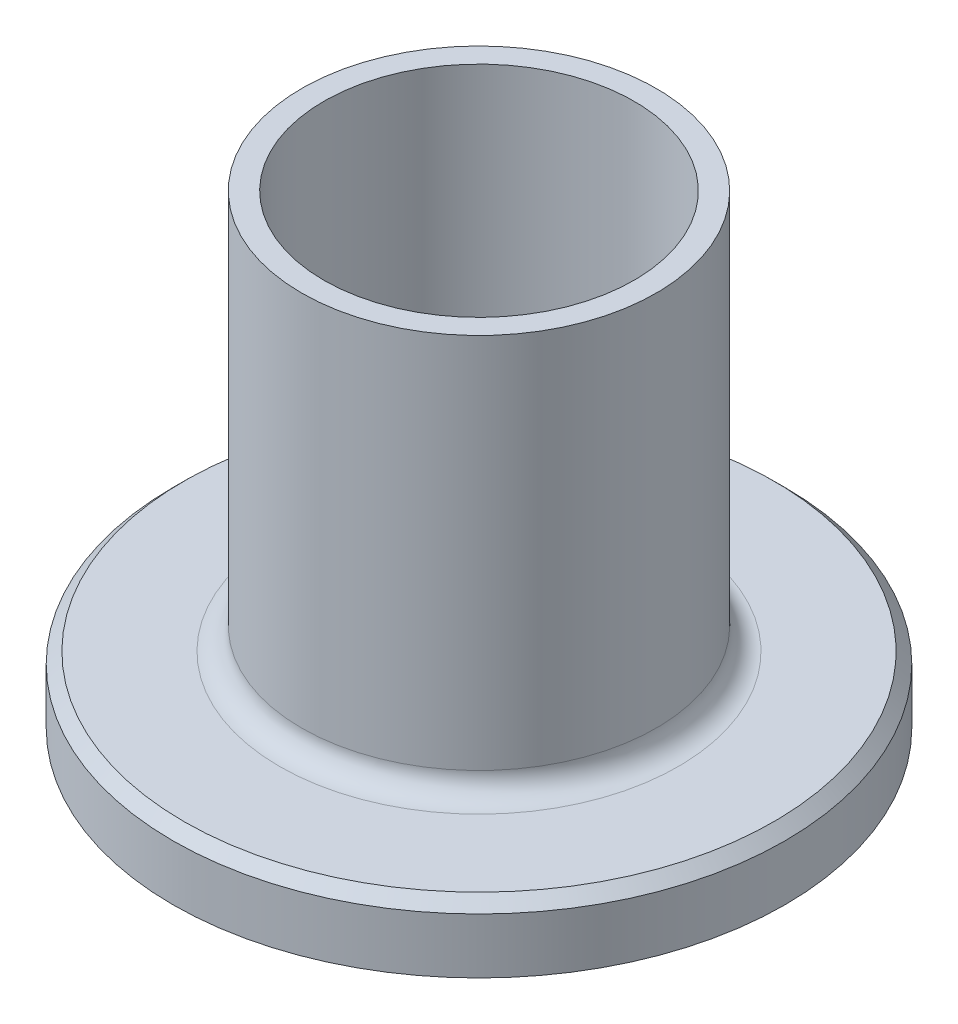
ISO-10303-21;
HEADER;
FILE_DESCRIPTION(('STEP AP214'),'2;1');
FILE_NAME('part.step','',(''),(''),'','','');
FILE_SCHEMA(('AUTOMOTIVE_DESIGN { 1 0 10303 214 1 1 1 1 }'));
ENDSEC;
DATA;
#1=APPLICATION_CONTEXT('core data for automotive mechanical design processes');
#2=APPLICATION_PROTOCOL_DEFINITION('international standard','automotive_design',2000,#1);
#3=PRODUCT_CONTEXT('',#1,'mechanical');
#4=PRODUCT('Part','Part','',(#3));
#5=PRODUCT_RELATED_PRODUCT_CATEGORY('part','',(#4));
#6=PRODUCT_DEFINITION_FORMATION('','',#4);
#7=PRODUCT_DEFINITION_CONTEXT('part definition',#1,'design');
#8=PRODUCT_DEFINITION('design','',#6,#7);
#9=PRODUCT_DEFINITION_SHAPE('','',#8);
#10=(LENGTH_UNIT() NAMED_UNIT(*) SI_UNIT(.MILLI.,.METRE.));
#11=(NAMED_UNIT(*) PLANE_ANGLE_UNIT() SI_UNIT($,.RADIAN.));
#12=(NAMED_UNIT(*) SI_UNIT($,.STERADIAN.) SOLID_ANGLE_UNIT());
#13=UNCERTAINTY_MEASURE_WITH_UNIT(LENGTH_MEASURE(1.E-05),#10,'distance_accuracy_value','');
#14=(GEOMETRIC_REPRESENTATION_CONTEXT(3) GLOBAL_UNCERTAINTY_ASSIGNED_CONTEXT((#13)) GLOBAL_UNIT_ASSIGNED_CONTEXT((#10,
#11,#12)) REPRESENTATION_CONTEXT('',''));
#15=CARTESIAN_POINT('',(0.,0.,0.));
#16=DIRECTION('',(0.,0.,1.));
#17=DIRECTION('',(1.,0.,0.));
#18=AXIS2_PLACEMENT_3D('',#15,#16,#17);
#19=CARTESIAN_POINT('',(0.,0.,0.));
#20=DIRECTION('',(0.,1.,0.));
#21=DIRECTION('',(0.,0.,1.));
#22=AXIS2_PLACEMENT_3D('',#19,#20,#21);
#23=PLANE('',#22);
#24=CARTESIAN_POINT('',(0.,0.,0.));
#25=DIRECTION('',(0.,1.,0.));
#26=DIRECTION('',(0.,0.,1.));
#27=AXIS2_PLACEMENT_3D('',#24,#25,#26);
#28=CIRCLE('',#27,21.1407400337106);
#29=CARTESIAN_POINT('',(0.,0.,21.1407400337106));
#30=VERTEX_POINT('',#29);
#31=EDGE_CURVE('E64',#30,#30,#28,.T.);
#32=ORIENTED_EDGE('',*,*,#31,.T.);
#33=EDGE_LOOP('',(#32));
#34=FACE_BOUND('',#33,.T.);
#35=CARTESIAN_POINT('',(0.,0.,0.));
#36=DIRECTION('',(0.,-1.,0.));
#37=DIRECTION('',(0.,0.,-1.));
#38=AXIS2_PLACEMENT_3D('',#35,#36,#37);
#39=CIRCLE('',#38,25.);
#40=CARTESIAN_POINT('',(0.,0.,-25.));
#41=VERTEX_POINT('',#40);
#42=EDGE_CURVE('E83',#41,#41,#39,.T.);
#43=ORIENTED_EDGE('',*,*,#42,.T.);
#44=EDGE_LOOP('',(#43));
#45=FACE_BOUND('',#44,.T.);
#46=ADVANCED_FACE('F38',(#34,#45),#23,.F.);
#47=CARTESIAN_POINT('',(0.,6.,0.));
#48=DIRECTION('',(0.,-1.,0.));
#49=DIRECTION('',(0.,0.,-1.));
#50=AXIS2_PLACEMENT_3D('',#47,#48,#49);
#51=CYLINDRICAL_SURFACE('',#50,27.62);
#52=CARTESIAN_POINT('',(0.,4.99999999999999,0.));
#53=DIRECTION('',(0.,1.,0.));
#54=DIRECTION('',(0.,0.,1.));
#55=AXIS2_PLACEMENT_3D('',#52,#53,#54);
#56=CIRCLE('',#55,27.62);
#57=CARTESIAN_POINT('',(0.,4.99999999999999,27.62));
#58=VERTEX_POINT('',#57);
#59=EDGE_CURVE('E58',#58,#58,#56,.F.);
#60=ORIENTED_EDGE('',*,*,#59,.T.);
#61=EDGE_LOOP('',(#60));
#62=FACE_BOUND('',#61,.T.);
#63=CARTESIAN_POINT('',(0.,0.,0.));
#64=DIRECTION('',(0.,1.,0.));
#65=DIRECTION('',(0.,0.,1.));
#66=AXIS2_PLACEMENT_3D('',#63,#64,#65);
#67=CIRCLE('',#66,27.62);
#68=CARTESIAN_POINT('',(0.,0.,27.62));
#69=VERTEX_POINT('',#68);
#70=EDGE_CURVE('E67',#69,#69,#67,.T.);
#71=ORIENTED_EDGE('',*,*,#70,.T.);
#72=EDGE_LOOP('',(#71));
#73=FACE_BOUND('',#72,.T.);
#74=ADVANCED_FACE('F113',(#62,#73),#51,.T.);
#75=CARTESIAN_POINT('',(0.,6.,0.));
#76=DIRECTION('',(0.,1.,0.));
#77=DIRECTION('',(0.,0.,1.));
#78=AXIS2_PLACEMENT_3D('',#75,#76,#77);
#79=PLANE('',#78);
#80=CARTESIAN_POINT('',(0.,6.,0.));
#81=DIRECTION('',(0.,1.,0.));
#82=DIRECTION('',(0.,0.,1.));
#83=AXIS2_PLACEMENT_3D('',#80,#81,#82);
#84=CIRCLE('',#83,18.);
#85=CARTESIAN_POINT('',(0.,6.,18.));
#86=VERTEX_POINT('',#85);
#87=EDGE_CURVE('E49',#86,#86,#84,.F.);
#88=ORIENTED_EDGE('',*,*,#87,.T.);
#89=EDGE_LOOP('',(#88));
#90=FACE_BOUND('',#89,.T.);
#91=CARTESIAN_POINT('',(0.,6.,0.));
#92=DIRECTION('',(0.,1.,0.));
#93=DIRECTION('',(0.,0.,1.));
#94=AXIS2_PLACEMENT_3D('',#91,#92,#93);
#95=CIRCLE('',#94,26.62);
#96=CARTESIAN_POINT('',(0.,6.,26.62));
#97=VERTEX_POINT('',#96);
#98=EDGE_CURVE('E61',#97,#97,#95,.T.);
#99=ORIENTED_EDGE('',*,*,#98,.T.);
#100=EDGE_LOOP('',(#99));
#101=FACE_BOUND('',#100,.T.);
#102=ADVANCED_FACE('F109',(#90,#101),#79,.T.);
#103=CARTESIAN_POINT('',(0.,0.,0.));
#104=DIRECTION('',(0.,-1.,0.));
#105=DIRECTION('',(0.,0.,-1.));
#106=AXIS2_PLACEMENT_3D('',#103,#104,#105);
#107=CIRCLE('',#106,27.);
#108=CARTESIAN_POINT('',(0.,0.,-27.));
#109=VERTEX_POINT('',#108);
#110=EDGE_CURVE('E77',#109,#109,#107,.T.);
#111=ORIENTED_EDGE('',*,*,#110,.F.);
#112=EDGE_LOOP('',(#111));
#113=FACE_BOUND('',#112,.T.);
#114=ORIENTED_EDGE('',*,*,#70,.F.);
#115=EDGE_LOOP('',(#114));
#116=FACE_BOUND('',#115,.T.);
#117=ADVANCED_FACE('F105',(#113,#116),#23,.F.);
#118=CARTESIAN_POINT('',(0.,42.,0.));
#119=DIRECTION('',(0.,1.,0.));
#120=DIRECTION('',(0.,0.,1.));
#121=AXIS2_PLACEMENT_3D('',#118,#119,#120);
#122=PLANE('',#121);
#123=CARTESIAN_POINT('',(0.,42.,0.));
#124=DIRECTION('',(0.,1.,0.));
#125=DIRECTION('',(0.,0.,1.));
#126=AXIS2_PLACEMENT_3D('',#123,#124,#125);
#127=CIRCLE('',#126,16.);
#128=CARTESIAN_POINT('',(0.,42.,16.));
#129=VERTEX_POINT('',#128);
#130=EDGE_CURVE('E70',#129,#129,#127,.T.);
#131=ORIENTED_EDGE('',*,*,#130,.T.);
#132=EDGE_LOOP('',(#131));
#133=FACE_BOUND('',#132,.T.);
#134=CARTESIAN_POINT('',(0.,42.,0.));
#135=DIRECTION('',(0.,1.,0.));
#136=DIRECTION('',(0.,0.,1.));
#137=AXIS2_PLACEMENT_3D('',#134,#135,#136);
#138=CIRCLE('',#137,14.);
#139=CARTESIAN_POINT('',(0.,42.,14.));
#140=VERTEX_POINT('',#139);
#141=EDGE_CURVE('E73',#140,#140,#138,.T.);
#142=ORIENTED_EDGE('',*,*,#141,.F.);
#143=EDGE_LOOP('',(#142));
#144=FACE_BOUND('',#143,.T.);
#145=ADVANCED_FACE('F108',(#133,#144),#122,.T.);
#146=CARTESIAN_POINT('',(0.,42.,0.));
#147=DIRECTION('',(0.,-1.,0.));
#148=DIRECTION('',(0.,0.,-1.));
#149=AXIS2_PLACEMENT_3D('',#146,#147,#148);
#150=CYLINDRICAL_SURFACE('',#149,16.);
#151=CARTESIAN_POINT('',(0.,8.,0.));
#152=DIRECTION('',(0.,1.,0.));
#153=DIRECTION('',(0.,0.,1.));
#154=AXIS2_PLACEMENT_3D('',#151,#152,#153);
#155=CIRCLE('',#154,16.);
#156=CARTESIAN_POINT('',(0.,8.,16.));
#157=VERTEX_POINT('',#156);
#158=EDGE_CURVE('E53',#157,#157,#155,.T.);
#159=ORIENTED_EDGE('',*,*,#158,.T.);
#160=EDGE_LOOP('',(#159));
#161=FACE_BOUND('',#160,.T.);
#162=ORIENTED_EDGE('',*,*,#130,.F.);
#163=EDGE_LOOP('',(#162));
#164=FACE_BOUND('',#163,.T.);
#165=ADVANCED_FACE('F144',(#161,#164),#150,.T.);
#166=CARTESIAN_POINT('',(0.,42.,0.));
#167=DIRECTION('',(0.,-1.,0.));
#168=DIRECTION('',(0.,0.,-1.));
#169=AXIS2_PLACEMENT_3D('',#166,#167,#168);
#170=CYLINDRICAL_SURFACE('',#169,14.);
#171=CARTESIAN_POINT('',(0.,7.08226820220699,0.));
#172=DIRECTION('',(0.,1.,0.));
#173=DIRECTION('',(0.,0.,1.));
#174=AXIS2_PLACEMENT_3D('',#171,#172,#173);
#175=CIRCLE('',#174,14.);
#176=CARTESIAN_POINT('',(0.,7.08226820220699,14.));
#177=VERTEX_POINT('',#176);
#178=EDGE_CURVE('E45',#177,#177,#175,.F.);
#179=ORIENTED_EDGE('',*,*,#178,.T.);
#180=EDGE_LOOP('',(#179));
#181=FACE_BOUND('',#180,.T.);
#182=ORIENTED_EDGE('',*,*,#141,.T.);
#183=EDGE_LOOP('',(#182));
#184=FACE_BOUND('',#183,.T.);
#185=ADVANCED_FACE('F128',(#181,#184),#170,.F.);
#186=CARTESIAN_POINT('',(0.,0.,0.));
#187=DIRECTION('',(0.,-1.,0.));
#188=DIRECTION('',(0.,0.,-1.));
#189=AXIS2_PLACEMENT_3D('',#186,#187,#188);
#190=CONICAL_SURFACE('',#189,21.1407400337106,0.95993108859688);
#191=CARTESIAN_POINT('',(0.,3.80566002505103,0.));
#192=DIRECTION('',(0.,1.,0.));
#193=DIRECTION('',(0.,0.,1.));
#194=AXIS2_PLACEMENT_3D('',#191,#192,#193);
#195=CIRCLE('',#194,15.7056942545958);
#196=CARTESIAN_POINT('',(0.,3.80566002505103,15.7056942545958));
#197=VERTEX_POINT('',#196);
#198=EDGE_CURVE('E10',#197,#197,#195,.T.);
#199=ORIENTED_EDGE('',*,*,#198,.T.);
#200=EDGE_LOOP('',(#199));
#201=FACE_BOUND('',#200,.T.);
#202=ORIENTED_EDGE('',*,*,#31,.F.);
#203=EDGE_LOOP('',(#202));
#204=FACE_BOUND('',#203,.T.);
#205=ADVANCED_FACE('F125',(#201,#204),#190,.F.);
#206=CARTESIAN_POINT('',(0.,6.,0.));
#207=DIRECTION('',(0.,-1.,0.));
#208=DIRECTION('',(0.,0.,-1.));
#209=AXIS2_PLACEMENT_3D('',#206,#207,#208);
#210=CONICAL_SURFACE('',#209,26.62,0.78539816339745);
#211=ORIENTED_EDGE('',*,*,#59,.F.);
#212=EDGE_LOOP('',(#211));
#213=FACE_BOUND('',#212,.T.);
#214=ORIENTED_EDGE('',*,*,#98,.F.);
#215=EDGE_LOOP('',(#214));
#216=FACE_BOUND('',#215,.T.);
#217=ADVANCED_FACE('F101',(#213,#216),#210,.T.);
#218=CARTESIAN_POINT('',(0.,1.6,0.));
#219=DIRECTION('',(0.,-1.,0.));
#220=DIRECTION('',(0.,0.,-1.));
#221=AXIS2_PLACEMENT_3D('',#218,#219,#220);
#222=CYLINDRICAL_SURFACE('',#221,27.);
#223=CARTESIAN_POINT('',(0.,1.6,0.));
#224=DIRECTION('',(0.,-1.,0.));
#225=DIRECTION('',(0.,0.,-1.));
#226=AXIS2_PLACEMENT_3D('',#223,#224,#225);
#227=CIRCLE('',#226,27.);
#228=CARTESIAN_POINT('',(0.,1.6,-27.));
#229=VERTEX_POINT('',#228);
#230=EDGE_CURVE('E76',#229,#229,#227,.T.);
#231=ORIENTED_EDGE('',*,*,#230,.F.);
#232=EDGE_LOOP('',(#231));
#233=FACE_BOUND('',#232,.T.);
#234=ORIENTED_EDGE('',*,*,#110,.T.);
#235=EDGE_LOOP('',(#234));
#236=FACE_BOUND('',#235,.T.);
#237=ADVANCED_FACE('F95',(#233,#236),#222,.F.);
#238=CARTESIAN_POINT('',(0.,1.6,0.));
#239=DIRECTION('',(0.,-1.,0.));
#240=DIRECTION('',(0.,0.,-1.));
#241=AXIS2_PLACEMENT_3D('',#238,#239,#240);
#242=PLANE('',#241);
#243=CARTESIAN_POINT('',(0.,1.6,0.));
#244=DIRECTION('',(0.,-1.,0.));
#245=DIRECTION('',(0.,0.,-1.));
#246=AXIS2_PLACEMENT_3D('',#243,#244,#245);
#247=CIRCLE('',#246,25.);
#248=CARTESIAN_POINT('',(0.,1.6,-25.));
#249=VERTEX_POINT('',#248);
#250=EDGE_CURVE('E80',#249,#249,#247,.T.);
#251=ORIENTED_EDGE('',*,*,#250,.F.);
#252=EDGE_LOOP('',(#251));
#253=FACE_BOUND('',#252,.T.);
#254=ORIENTED_EDGE('',*,*,#230,.T.);
#255=EDGE_LOOP('',(#254));
#256=FACE_BOUND('',#255,.T.);
#257=ADVANCED_FACE('F92',(#253,#256),#242,.T.);
#258=CARTESIAN_POINT('',(0.,1.6,0.));
#259=DIRECTION('',(0.,-1.,0.));
#260=DIRECTION('',(0.,0.,-1.));
#261=AXIS2_PLACEMENT_3D('',#258,#259,#260);
#262=CYLINDRICAL_SURFACE('',#261,25.);
#263=ORIENTED_EDGE('',*,*,#250,.T.);
#264=EDGE_LOOP('',(#263));
#265=FACE_BOUND('',#264,.T.);
#266=ORIENTED_EDGE('',*,*,#42,.F.);
#267=EDGE_LOOP('',(#266));
#268=FACE_BOUND('',#267,.T.);
#269=ADVANCED_FACE('F89',(#265,#268),#262,.T.);
#270=CARTESIAN_POINT('',(0.,8.,0.));
#271=DIRECTION('',(0.,1.,0.));
#272=DIRECTION('',(0.,0.,1.));
#273=AXIS2_PLACEMENT_3D('',#270,#271,#272);
#274=TOROIDAL_SURFACE('',#273,18.,2.);
#275=ORIENTED_EDGE('',*,*,#87,.F.);
#276=EDGE_LOOP('',(#275));
#277=FACE_BOUND('',#276,.T.);
#278=ORIENTED_EDGE('',*,*,#158,.F.);
#279=EDGE_LOOP('',(#278));
#280=FACE_BOUND('',#279,.T.);
#281=ADVANCED_FACE('F131',(#277,#280),#274,.F.);
#282=CARTESIAN_POINT('',(0.,7.08226820220699,0.));
#283=DIRECTION('',(0.,1.,0.));
#284=DIRECTION('',(0.,0.,1.));
#285=AXIS2_PLACEMENT_3D('',#282,#283,#284);
#286=TOROIDAL_SURFACE('',#285,18.,4.);
#287=ORIENTED_EDGE('',*,*,#198,.F.);
#288=EDGE_LOOP('',(#287));
#289=FACE_BOUND('',#288,.T.);
#290=ORIENTED_EDGE('',*,*,#178,.F.);
#291=EDGE_LOOP('',(#290));
#292=FACE_BOUND('',#291,.T.);
#293=ADVANCED_FACE('F40',(#289,#292),#286,.T.);
#294=CLOSED_SHELL('',(#46,#74,#102,#117,#145,#165,#185,#205,#217,#237,#257,#269,#281,#293));
#295=MANIFOLD_SOLID_BREP('B2',#294);
#296=ADVANCED_BREP_SHAPE_REPRESENTATION('',(#18,#295),#14);
#297=SHAPE_DEFINITION_REPRESENTATION(#9,#296);
ENDSEC;
END-ISO-10303-21;
